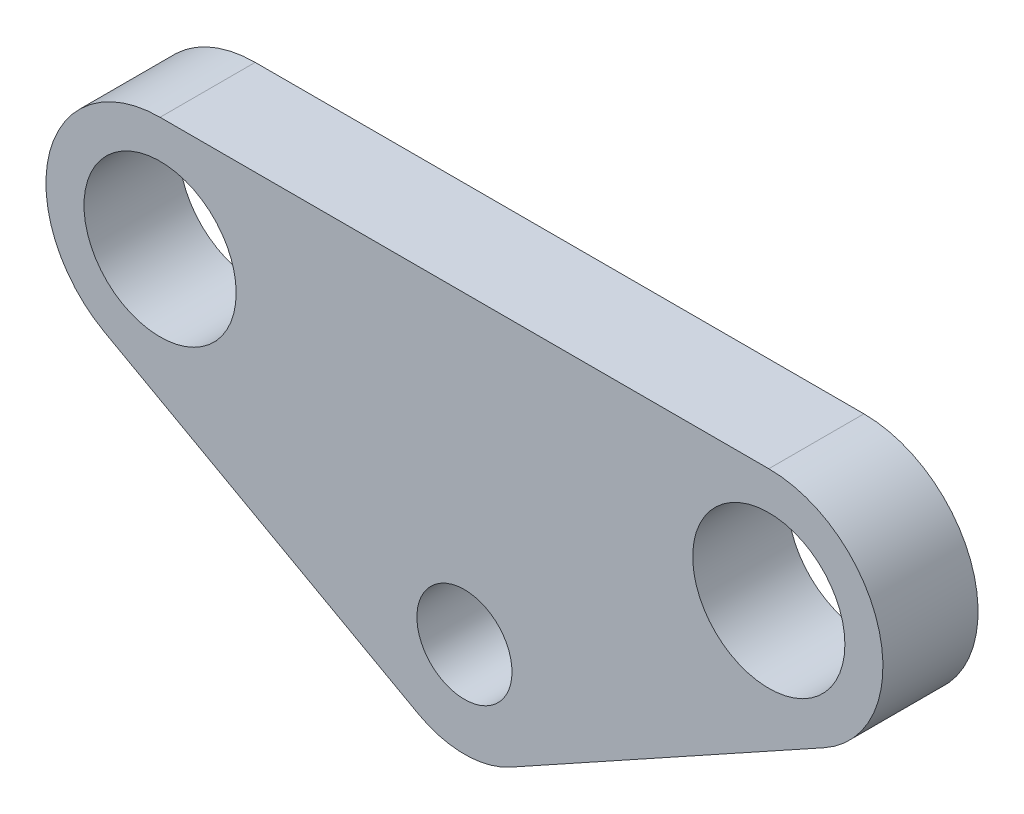
ISO-10303-21;
HEADER;
FILE_DESCRIPTION(('STEP AP214'),'2;1');
FILE_NAME('part.step','',(''),(''),'','','');
FILE_SCHEMA(('AUTOMOTIVE_DESIGN { 1 0 10303 214 1 1 1 1 }'));
ENDSEC;
DATA;
#1=APPLICATION_CONTEXT('core data for automotive mechanical design processes');
#2=APPLICATION_PROTOCOL_DEFINITION('international standard','automotive_design',2000,#1);
#3=PRODUCT_CONTEXT('',#1,'mechanical');
#4=PRODUCT('Part','Part','',(#3));
#5=PRODUCT_RELATED_PRODUCT_CATEGORY('part','',(#4));
#6=PRODUCT_DEFINITION_FORMATION('','',#4);
#7=PRODUCT_DEFINITION_CONTEXT('part definition',#1,'design');
#8=PRODUCT_DEFINITION('design','',#6,#7);
#9=PRODUCT_DEFINITION_SHAPE('','',#8);
#10=(LENGTH_UNIT() NAMED_UNIT(*) SI_UNIT(.MILLI.,.METRE.));
#11=(NAMED_UNIT(*) PLANE_ANGLE_UNIT() SI_UNIT($,.RADIAN.));
#12=(NAMED_UNIT(*) SI_UNIT($,.STERADIAN.) SOLID_ANGLE_UNIT());
#13=UNCERTAINTY_MEASURE_WITH_UNIT(LENGTH_MEASURE(1.E-05),#10,'distance_accuracy_value','');
#14=(GEOMETRIC_REPRESENTATION_CONTEXT(3) GLOBAL_UNCERTAINTY_ASSIGNED_CONTEXT((#13)) GLOBAL_UNIT_ASSIGNED_CONTEXT((#10,
#11,#12)) REPRESENTATION_CONTEXT('',''));
#15=CARTESIAN_POINT('',(0.,0.,0.));
#16=DIRECTION('',(0.,0.,1.));
#17=DIRECTION('',(1.,0.,0.));
#18=AXIS2_PLACEMENT_3D('',#15,#16,#17);
#19=CARTESIAN_POINT('',(-2.42155107885067,-4.37448172616107,5.));
#20=DIRECTION('',(0.484310215770134,0.874896345232214,0.));
#21=DIRECTION('',(-0.874896345232214,0.484310215770134,0.));
#22=AXIS2_PLACEMENT_3D('',#19,#20,#21);
#23=PLANE('',#22);
#24=DIRECTION('',(0.874896345232214,-0.484310215770134,0.));
#25=VECTOR('',#24,1.);
#26=CARTESIAN_POINT('',(-2.42155107885067,-4.37448172616107,0.));
#27=LINE('',#26,#25);
#28=CARTESIAN_POINT('',(-18.9058612946208,4.75062192860672,0.));
#29=VERTEX_POINT('',#28);
#30=CARTESIAN_POINT('',(-2.42155107885067,-4.37448172616107,0.));
#31=VERTEX_POINT('',#30);
#32=EDGE_CURVE('E130',#29,#31,#27,.T.);
#33=ORIENTED_EDGE('',*,*,#32,.T.);
#34=DIRECTION('',(0.,0.,-1.));
#35=VECTOR('',#34,1.);
#36=CARTESIAN_POINT('',(-2.42155107885067,-4.37448172616107,5.));
#37=LINE('',#36,#35);
#38=CARTESIAN_POINT('',(-2.42155107885067,-4.37448172616107,5.));
#39=VERTEX_POINT('',#38);
#40=EDGE_CURVE('E12',#39,#31,#37,.T.);
#41=ORIENTED_EDGE('',*,*,#40,.F.);
#42=DIRECTION('',(0.874896345232214,-0.484310215770134,0.));
#43=VECTOR('',#42,1.);
#44=CARTESIAN_POINT('',(-2.42155107885067,-4.37448172616107,5.));
#45=LINE('',#44,#43);
#46=CARTESIAN_POINT('',(-18.9058612946208,4.75062192860672,5.));
#47=VERTEX_POINT('',#46);
#48=EDGE_CURVE('E263',#47,#39,#45,.T.);
#49=ORIENTED_EDGE('',*,*,#48,.F.);
#50=DIRECTION('',(0.,0.,-1.));
#51=VECTOR('',#50,1.);
#52=CARTESIAN_POINT('',(-18.9058612946208,4.75062192860672,5.));
#53=LINE('',#52,#51);
#54=EDGE_CURVE('E52',#47,#29,#53,.T.);
#55=ORIENTED_EDGE('',*,*,#54,.T.);
#56=EDGE_LOOP('',(#33,#41,#49,#55));
#57=FACE_BOUND('',#56,.T.);
#58=ADVANCED_FACE('F35',(#57),#23,.F.);
#59=CARTESIAN_POINT('',(0.,0.,5.));
#60=DIRECTION('',(0.,0.,-1.));
#61=DIRECTION('',(-1.,0.,0.));
#62=AXIS2_PLACEMENT_3D('',#59,#60,#61);
#63=CYLINDRICAL_SURFACE('',#62,5.);
#64=CARTESIAN_POINT('',(0.,0.,0.));
#65=DIRECTION('',(0.,0.,1.));
#66=DIRECTION('',(1.,0.,0.));
#67=AXIS2_PLACEMENT_3D('',#64,#65,#66);
#68=CIRCLE('',#67,5.);
#69=CARTESIAN_POINT('',(2.42155107885067,-4.37448172616107,0.));
#70=VERTEX_POINT('',#69);
#71=EDGE_CURVE('E132',#31,#70,#68,.T.);
#72=ORIENTED_EDGE('',*,*,#71,.T.);
#73=DIRECTION('',(0.,0.,-1.));
#74=VECTOR('',#73,1.);
#75=CARTESIAN_POINT('',(2.42155107885067,-4.37448172616107,5.));
#76=LINE('',#75,#74);
#77=CARTESIAN_POINT('',(2.42155107885067,-4.37448172616107,5.));
#78=VERTEX_POINT('',#77);
#79=EDGE_CURVE('E44',#78,#70,#76,.T.);
#80=ORIENTED_EDGE('',*,*,#79,.F.);
#81=CARTESIAN_POINT('',(0.,0.,5.));
#82=DIRECTION('',(0.,0.,1.));
#83=DIRECTION('',(1.,0.,0.));
#84=AXIS2_PLACEMENT_3D('',#81,#82,#83);
#85=CIRCLE('',#84,5.);
#86=EDGE_CURVE('E84',#39,#78,#85,.T.);
#87=ORIENTED_EDGE('',*,*,#86,.F.);
#88=ORIENTED_EDGE('',*,*,#40,.T.);
#89=EDGE_LOOP('',(#72,#80,#87,#88));
#90=FACE_BOUND('',#89,.T.);
#91=ADVANCED_FACE('F150',(#90),#63,.T.);
#92=CARTESIAN_POINT('',(2.42155107885067,-4.37448172616107,5.));
#93=DIRECTION('',(0.484310215770134,-0.874896345232214,0.));
#94=DIRECTION('',(0.874896345232214,0.484310215770134,0.));
#95=AXIS2_PLACEMENT_3D('',#92,#93,#94);
#96=PLANE('',#95);
#97=DIRECTION('',(-0.874896345232214,-0.484310215770134,0.));
#98=VECTOR('',#97,1.);
#99=CARTESIAN_POINT('',(2.42155107885067,-4.37448172616107,0.));
#100=LINE('',#99,#98);
#101=CARTESIAN_POINT('',(18.9058612946208,4.75062192860672,0.));
#102=VERTEX_POINT('',#101);
#103=EDGE_CURVE('E135',#102,#70,#100,.T.);
#104=ORIENTED_EDGE('',*,*,#103,.F.);
#105=DIRECTION('',(0.,0.,-1.));
#106=VECTOR('',#105,1.);
#107=CARTESIAN_POINT('',(18.9058612946208,4.75062192860672,5.));
#108=LINE('',#107,#106);
#109=CARTESIAN_POINT('',(18.9058612946208,4.75062192860672,5.));
#110=VERTEX_POINT('',#109);
#111=EDGE_CURVE('E112',#110,#102,#108,.T.);
#112=ORIENTED_EDGE('',*,*,#111,.F.);
#113=DIRECTION('',(-0.874896345232214,-0.484310215770134,0.));
#114=VECTOR('',#113,1.);
#115=CARTESIAN_POINT('',(2.42155107885067,-4.37448172616107,5.));
#116=LINE('',#115,#114);
#117=EDGE_CURVE('E102',#110,#78,#116,.T.);
#118=ORIENTED_EDGE('',*,*,#117,.T.);
#119=ORIENTED_EDGE('',*,*,#79,.T.);
#120=EDGE_LOOP('',(#104,#112,#118,#119));
#121=FACE_BOUND('',#120,.T.);
#122=ADVANCED_FACE('F149',(#121),#96,.T.);
#123=CARTESIAN_POINT('',(16.,10.,5.));
#124=DIRECTION('',(0.,0.,-1.));
#125=DIRECTION('',(-1.,0.,0.));
#126=AXIS2_PLACEMENT_3D('',#123,#124,#125);
#127=CYLINDRICAL_SURFACE('',#126,6.);
#128=CARTESIAN_POINT('',(16.,10.,0.));
#129=DIRECTION('',(0.,0.,1.));
#130=DIRECTION('',(1.,0.,0.));
#131=AXIS2_PLACEMENT_3D('',#128,#129,#130);
#132=CIRCLE('',#131,6.);
#133=CARTESIAN_POINT('',(16.,16.,0.));
#134=VERTEX_POINT('',#133);
#135=EDGE_CURVE('E109',#102,#134,#132,.T.);
#136=ORIENTED_EDGE('',*,*,#135,.T.);
#137=DIRECTION('',(0.,0.,-1.));
#138=VECTOR('',#137,1.);
#139=CARTESIAN_POINT('',(16.,16.,5.));
#140=LINE('',#139,#138);
#141=CARTESIAN_POINT('',(16.,16.,5.));
#142=VERTEX_POINT('',#141);
#143=EDGE_CURVE('E106',#142,#134,#140,.T.);
#144=ORIENTED_EDGE('',*,*,#143,.F.);
#145=CARTESIAN_POINT('',(16.,10.,5.));
#146=DIRECTION('',(0.,0.,1.));
#147=DIRECTION('',(1.,0.,0.));
#148=AXIS2_PLACEMENT_3D('',#145,#146,#147);
#149=CIRCLE('',#148,6.);
#150=EDGE_CURVE('E95',#110,#142,#149,.T.);
#151=ORIENTED_EDGE('',*,*,#150,.F.);
#152=ORIENTED_EDGE('',*,*,#111,.T.);
#153=EDGE_LOOP('',(#136,#144,#151,#152));
#154=FACE_BOUND('',#153,.T.);
#155=ADVANCED_FACE('F107',(#154),#127,.T.);
#156=CARTESIAN_POINT('',(0.,16.,5.));
#157=DIRECTION('',(0.,1.,0.));
#158=DIRECTION('',(0.,0.,1.));
#159=AXIS2_PLACEMENT_3D('',#156,#157,#158);
#160=PLANE('',#159);
#161=DIRECTION('',(1.,0.,0.));
#162=VECTOR('',#161,1.);
#163=CARTESIAN_POINT('',(0.,16.,0.));
#164=LINE('',#163,#162);
#165=CARTESIAN_POINT('',(-16.,16.,0.));
#166=VERTEX_POINT('',#165);
#167=EDGE_CURVE('E139',#166,#134,#164,.T.);
#168=ORIENTED_EDGE('',*,*,#167,.F.);
#169=DIRECTION('',(0.,0.,-1.));
#170=VECTOR('',#169,1.);
#171=CARTESIAN_POINT('',(-16.,16.,5.));
#172=LINE('',#171,#170);
#173=CARTESIAN_POINT('',(-16.,16.,5.));
#174=VERTEX_POINT('',#173);
#175=EDGE_CURVE('E72',#174,#166,#172,.T.);
#176=ORIENTED_EDGE('',*,*,#175,.F.);
#177=DIRECTION('',(1.,0.,0.));
#178=VECTOR('',#177,1.);
#179=CARTESIAN_POINT('',(0.,16.,5.));
#180=LINE('',#179,#178);
#181=EDGE_CURVE('E100',#174,#142,#180,.T.);
#182=ORIENTED_EDGE('',*,*,#181,.T.);
#183=ORIENTED_EDGE('',*,*,#143,.T.);
#184=EDGE_LOOP('',(#168,#176,#182,#183));
#185=FACE_BOUND('',#184,.T.);
#186=ADVANCED_FACE('F114',(#185),#160,.T.);
#187=CARTESIAN_POINT('',(0.,0.,5.));
#188=DIRECTION('',(0.,0.,-1.));
#189=DIRECTION('',(-1.,0.,0.));
#190=AXIS2_PLACEMENT_3D('',#187,#188,#189);
#191=CYLINDRICAL_SURFACE('',#190,2.5);
#192=CARTESIAN_POINT('',(0.,0.,5.));
#193=DIRECTION('',(0.,0.,1.));
#194=DIRECTION('',(1.,0.,0.));
#195=AXIS2_PLACEMENT_3D('',#192,#193,#194);
#196=CIRCLE('',#195,2.5);
#197=CARTESIAN_POINT('',(2.5,0.,5.));
#198=VERTEX_POINT('',#197);
#199=EDGE_CURVE('E260',#198,#198,#196,.T.);
#200=ORIENTED_EDGE('',*,*,#199,.T.);
#201=EDGE_LOOP('',(#200));
#202=FACE_BOUND('',#201,.T.);
#203=CARTESIAN_POINT('',(0.,0.,0.));
#204=DIRECTION('',(0.,0.,1.));
#205=DIRECTION('',(1.,0.,0.));
#206=AXIS2_PLACEMENT_3D('',#203,#204,#205);
#207=CIRCLE('',#206,2.5);
#208=CARTESIAN_POINT('',(2.5,0.,0.));
#209=VERTEX_POINT('',#208);
#210=EDGE_CURVE('E127',#209,#209,#207,.T.);
#211=ORIENTED_EDGE('',*,*,#210,.F.);
#212=EDGE_LOOP('',(#211));
#213=FACE_BOUND('',#212,.T.);
#214=ADVANCED_FACE('F175',(#202,#213),#191,.F.);
#215=CARTESIAN_POINT('',(-16.,10.,5.));
#216=DIRECTION('',(0.,0.,-1.));
#217=DIRECTION('',(-1.,0.,0.));
#218=AXIS2_PLACEMENT_3D('',#215,#216,#217);
#219=CYLINDRICAL_SURFACE('',#218,4.);
#220=CARTESIAN_POINT('',(-16.,10.,5.));
#221=DIRECTION('',(0.,0.,1.));
#222=DIRECTION('',(1.,0.,0.));
#223=AXIS2_PLACEMENT_3D('',#220,#221,#222);
#224=CIRCLE('',#223,4.);
#225=CARTESIAN_POINT('',(-12.,10.,5.));
#226=VERTEX_POINT('',#225);
#227=EDGE_CURVE('E185',#226,#226,#224,.T.);
#228=ORIENTED_EDGE('',*,*,#227,.T.);
#229=EDGE_LOOP('',(#228));
#230=FACE_BOUND('',#229,.T.);
#231=CARTESIAN_POINT('',(-16.,10.,0.));
#232=DIRECTION('',(0.,0.,1.));
#233=DIRECTION('',(1.,0.,0.));
#234=AXIS2_PLACEMENT_3D('',#231,#232,#233);
#235=CIRCLE('',#234,4.);
#236=CARTESIAN_POINT('',(-12.,10.,0.));
#237=VERTEX_POINT('',#236);
#238=EDGE_CURVE('E124',#237,#237,#235,.T.);
#239=ORIENTED_EDGE('',*,*,#238,.F.);
#240=EDGE_LOOP('',(#239));
#241=FACE_BOUND('',#240,.T.);
#242=ADVANCED_FACE('F163',(#230,#241),#219,.F.);
#243=CARTESIAN_POINT('',(16.,10.,5.));
#244=DIRECTION('',(0.,0.,-1.));
#245=DIRECTION('',(-1.,0.,0.));
#246=AXIS2_PLACEMENT_3D('',#243,#244,#245);
#247=CYLINDRICAL_SURFACE('',#246,4.);
#248=CARTESIAN_POINT('',(16.,10.,5.));
#249=DIRECTION('',(0.,0.,1.));
#250=DIRECTION('',(1.,0.,0.));
#251=AXIS2_PLACEMENT_3D('',#248,#249,#250);
#252=CIRCLE('',#251,4.);
#253=CARTESIAN_POINT('',(20.,10.,5.));
#254=VERTEX_POINT('',#253);
#255=EDGE_CURVE('E144',#254,#254,#252,.F.);
#256=ORIENTED_EDGE('',*,*,#255,.F.);
#257=EDGE_LOOP('',(#256));
#258=FACE_BOUND('',#257,.T.);
#259=CARTESIAN_POINT('',(16.,10.,0.));
#260=DIRECTION('',(0.,0.,1.));
#261=DIRECTION('',(1.,0.,0.));
#262=AXIS2_PLACEMENT_3D('',#259,#260,#261);
#263=CIRCLE('',#262,4.);
#264=CARTESIAN_POINT('',(20.,10.,0.));
#265=VERTEX_POINT('',#264);
#266=EDGE_CURVE('E121',#265,#265,#263,.F.);
#267=ORIENTED_EDGE('',*,*,#266,.T.);
#268=EDGE_LOOP('',(#267));
#269=FACE_BOUND('',#268,.T.);
#270=ADVANCED_FACE('F37',(#258,#269),#247,.F.);
#271=CARTESIAN_POINT('',(-16.,10.,5.));
#272=DIRECTION('',(0.,0.,-1.));
#273=DIRECTION('',(-1.,0.,0.));
#274=AXIS2_PLACEMENT_3D('',#271,#272,#273);
#275=CYLINDRICAL_SURFACE('',#274,6.);
#276=CARTESIAN_POINT('',(-16.,10.,0.));
#277=DIRECTION('',(0.,0.,1.));
#278=DIRECTION('',(1.,0.,0.));
#279=AXIS2_PLACEMENT_3D('',#276,#277,#278);
#280=CIRCLE('',#279,6.);
#281=EDGE_CURVE('E141',#29,#166,#280,.F.);
#282=ORIENTED_EDGE('',*,*,#281,.F.);
#283=ORIENTED_EDGE('',*,*,#54,.F.);
#284=CARTESIAN_POINT('',(-16.,10.,5.));
#285=DIRECTION('',(0.,0.,1.));
#286=DIRECTION('',(1.,0.,0.));
#287=AXIS2_PLACEMENT_3D('',#284,#285,#286);
#288=CIRCLE('',#287,6.);
#289=EDGE_CURVE('E115',#47,#174,#288,.F.);
#290=ORIENTED_EDGE('',*,*,#289,.T.);
#291=ORIENTED_EDGE('',*,*,#175,.T.);
#292=EDGE_LOOP('',(#282,#283,#290,#291));
#293=FACE_BOUND('',#292,.T.);
#294=ADVANCED_FACE('F154',(#293),#275,.T.);
#295=CARTESIAN_POINT('',(0.,0.,5.));
#296=DIRECTION('',(0.,0.,1.));
#297=DIRECTION('',(1.,0.,0.));
#298=AXIS2_PLACEMENT_3D('',#295,#296,#297);
#299=PLANE('',#298);
#300=ORIENTED_EDGE('',*,*,#255,.T.);
#301=EDGE_LOOP('',(#300));
#302=FACE_BOUND('',#301,.T.);
#303=ORIENTED_EDGE('',*,*,#227,.F.);
#304=EDGE_LOOP('',(#303));
#305=FACE_BOUND('',#304,.T.);
#306=ORIENTED_EDGE('',*,*,#199,.F.);
#307=EDGE_LOOP('',(#306));
#308=FACE_BOUND('',#307,.T.);
#309=ORIENTED_EDGE('',*,*,#48,.T.);
#310=ORIENTED_EDGE('',*,*,#86,.T.);
#311=ORIENTED_EDGE('',*,*,#117,.F.);
#312=ORIENTED_EDGE('',*,*,#150,.T.);
#313=ORIENTED_EDGE('',*,*,#181,.F.);
#314=ORIENTED_EDGE('',*,*,#289,.F.);
#315=EDGE_LOOP('',(#309,#310,#311,#312,#313,#314));
#316=FACE_BOUND('',#315,.T.);
#317=ADVANCED_FACE('F97',(#302,#305,#308,#316),#299,.T.);
#318=CARTESIAN_POINT('',(0.,0.,0.));
#319=DIRECTION('',(0.,0.,1.));
#320=DIRECTION('',(1.,0.,0.));
#321=AXIS2_PLACEMENT_3D('',#318,#319,#320);
#322=PLANE('',#321);
#323=ORIENTED_EDGE('',*,*,#266,.F.);
#324=EDGE_LOOP('',(#323));
#325=FACE_BOUND('',#324,.T.);
#326=ORIENTED_EDGE('',*,*,#238,.T.);
#327=EDGE_LOOP('',(#326));
#328=FACE_BOUND('',#327,.T.);
#329=ORIENTED_EDGE('',*,*,#210,.T.);
#330=EDGE_LOOP('',(#329));
#331=FACE_BOUND('',#330,.T.);
#332=ORIENTED_EDGE('',*,*,#32,.F.);
#333=ORIENTED_EDGE('',*,*,#281,.T.);
#334=ORIENTED_EDGE('',*,*,#167,.T.);
#335=ORIENTED_EDGE('',*,*,#135,.F.);
#336=ORIENTED_EDGE('',*,*,#103,.T.);
#337=ORIENTED_EDGE('',*,*,#71,.F.);
#338=EDGE_LOOP('',(#332,#333,#334,#335,#336,#337));
#339=FACE_BOUND('',#338,.T.);
#340=ADVANCED_FACE('F153',(#325,#328,#331,#339),#322,.F.);
#341=CLOSED_SHELL('',(#58,#91,#122,#155,#186,#214,#242,#270,#294,#317,#340));
#342=MANIFOLD_SOLID_BREP('B2',#341);
#343=ADVANCED_BREP_SHAPE_REPRESENTATION('',(#18,#342),#14);
#344=SHAPE_DEFINITION_REPRESENTATION(#9,#343);
ENDSEC;
END-ISO-10303-21;
